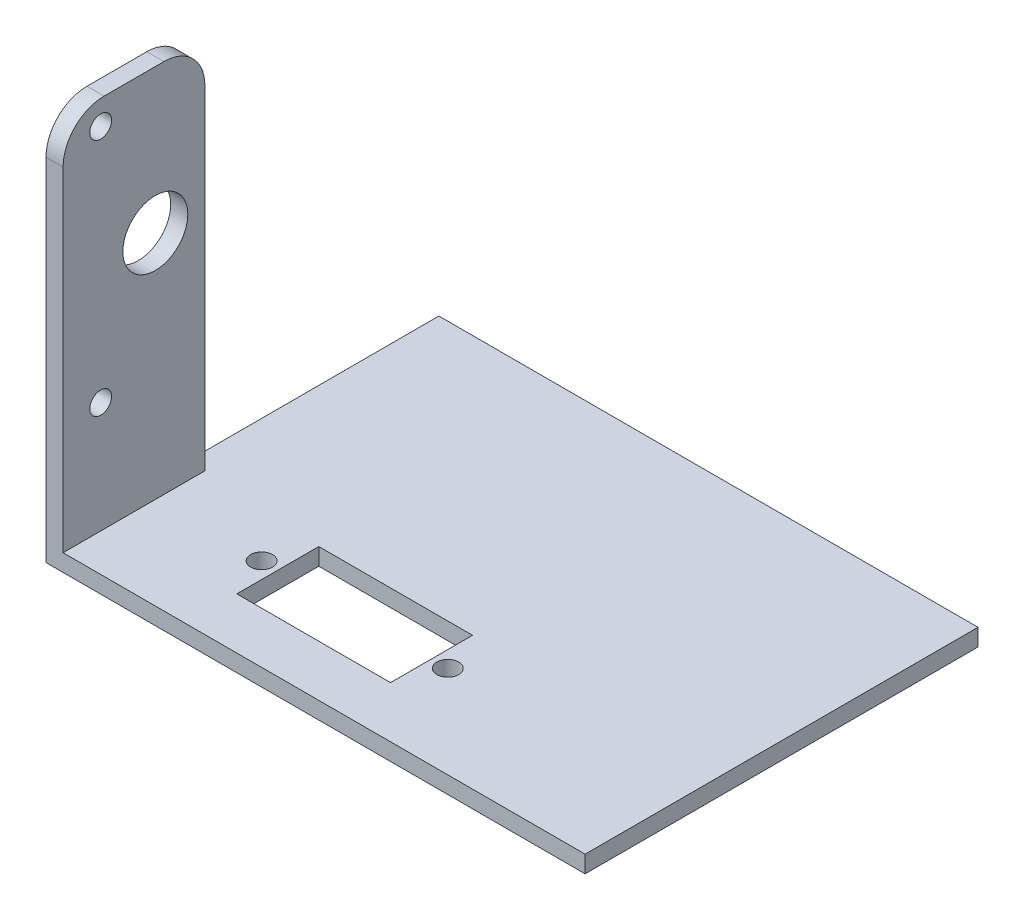
ISO-10303-21;
HEADER;
FILE_DESCRIPTION(('STEP AP214'),'2;1');
FILE_NAME('part.step','',(''),(''),'','','');
FILE_SCHEMA(('AUTOMOTIVE_DESIGN { 1 0 10303 214 1 1 1 1 }'));
ENDSEC;
DATA;
#1=APPLICATION_CONTEXT('core data for automotive mechanical design processes');
#2=APPLICATION_PROTOCOL_DEFINITION('international standard','automotive_design',2000,#1);
#3=PRODUCT_CONTEXT('',#1,'mechanical');
#4=PRODUCT('Part','Part','',(#3));
#5=PRODUCT_RELATED_PRODUCT_CATEGORY('part','',(#4));
#6=PRODUCT_DEFINITION_FORMATION('','',#4);
#7=PRODUCT_DEFINITION_CONTEXT('part definition',#1,'design');
#8=PRODUCT_DEFINITION('design','',#6,#7);
#9=PRODUCT_DEFINITION_SHAPE('','',#8);
#10=(LENGTH_UNIT() NAMED_UNIT(*) SI_UNIT(.MILLI.,.METRE.));
#11=(NAMED_UNIT(*) PLANE_ANGLE_UNIT() SI_UNIT($,.RADIAN.));
#12=(NAMED_UNIT(*) SI_UNIT($,.STERADIAN.) SOLID_ANGLE_UNIT());
#13=UNCERTAINTY_MEASURE_WITH_UNIT(LENGTH_MEASURE(1.E-05),#10,'distance_accuracy_value','');
#14=(GEOMETRIC_REPRESENTATION_CONTEXT(3) GLOBAL_UNCERTAINTY_ASSIGNED_CONTEXT((#13)) GLOBAL_UNIT_ASSIGNED_CONTEXT((#10,
#11,#12)) REPRESENTATION_CONTEXT('',''));
#15=CARTESIAN_POINT('',(0.,0.,0.));
#16=DIRECTION('',(0.,0.,1.));
#17=DIRECTION('',(1.,0.,0.));
#18=AXIS2_PLACEMENT_3D('',#15,#16,#17);
#19=CARTESIAN_POINT('',(0.,2.5,0.));
#20=DIRECTION('',(0.,-1.,0.));
#21=DIRECTION('',(0.,0.,-1.));
#22=AXIS2_PLACEMENT_3D('',#19,#20,#21);
#23=PLANE('',#22);
#24=DIRECTION('',(-1.,0.,0.));
#25=VECTOR('',#24,1.);
#26=CARTESIAN_POINT('',(40.,2.5,30.));
#27=LINE('',#26,#25);
#28=CARTESIAN_POINT('',(16.25,2.5,30.));
#29=VERTEX_POINT('',#28);
#30=CARTESIAN_POINT('',(-6.24999999999999,2.5,30.));
#31=VERTEX_POINT('',#30);
#32=EDGE_CURVE('E151',#29,#31,#27,.T.);
#33=ORIENTED_EDGE('',*,*,#32,.T.);
#34=DIRECTION('',(0.,0.,-1.));
#35=VECTOR('',#34,1.);
#36=CARTESIAN_POINT('',(-6.24999999999999,2.5,0.));
#37=LINE('',#36,#35);
#38=CARTESIAN_POINT('',(-6.24999999999999,2.5,18.));
#39=VERTEX_POINT('',#38);
#40=EDGE_CURVE('E175',#31,#39,#37,.T.);
#41=ORIENTED_EDGE('',*,*,#40,.T.);
#42=DIRECTION('',(-1.,0.,0.));
#43=VECTOR('',#42,1.);
#44=CARTESIAN_POINT('',(0.,2.5,18.));
#45=LINE('',#44,#43);
#46=CARTESIAN_POINT('',(16.25,2.5,18.));
#47=VERTEX_POINT('',#46);
#48=EDGE_CURVE('E172',#47,#39,#45,.T.);
#49=ORIENTED_EDGE('',*,*,#48,.F.);
#50=DIRECTION('',(0.,0.,-1.));
#51=VECTOR('',#50,1.);
#52=CARTESIAN_POINT('',(16.25,2.5,0.));
#53=LINE('',#52,#51);
#54=EDGE_CURVE('E167',#29,#47,#53,.T.);
#55=ORIENTED_EDGE('',*,*,#54,.F.);
#56=EDGE_LOOP('',(#33,#41,#49,#55));
#57=FACE_BOUND('',#56,.T.);
#58=CARTESIAN_POINT('',(-8.625,2.5,24.));
#59=DIRECTION('',(0.,1.,0.));
#60=DIRECTION('',(0.,0.,1.));
#61=AXIS2_PLACEMENT_3D('',#58,#59,#60);
#62=CIRCLE('',#61,1.6);
#63=CARTESIAN_POINT('',(-8.625,2.5,25.6));
#64=VERTEX_POINT('',#63);
#65=EDGE_CURVE('E164',#64,#64,#62,.T.);
#66=ORIENTED_EDGE('',*,*,#65,.F.);
#67=EDGE_LOOP('',(#66));
#68=FACE_BOUND('',#67,.T.);
#69=CARTESIAN_POINT('',(18.625,2.5,24.));
#70=DIRECTION('',(0.,1.,0.));
#71=DIRECTION('',(0.,0.,1.));
#72=AXIS2_PLACEMENT_3D('',#69,#70,#71);
#73=CIRCLE('',#72,1.6);
#74=CARTESIAN_POINT('',(18.625,2.5,25.6));
#75=VERTEX_POINT('',#74);
#76=EDGE_CURVE('E163',#75,#75,#73,.T.);
#77=ORIENTED_EDGE('',*,*,#76,.F.);
#78=EDGE_LOOP('',(#77));
#79=FACE_BOUND('',#78,.T.);
#80=DIRECTION('',(-1.,0.,0.));
#81=VECTOR('',#80,1.);
#82=CARTESIAN_POINT('',(-40.,2.5,37.5));
#83=LINE('',#82,#81);
#84=CARTESIAN_POINT('',(52.225,2.5,37.5));
#85=VERTEX_POINT('',#84);
#86=CARTESIAN_POINT('',(-24.175,2.5,37.5));
#87=VERTEX_POINT('',#86);
#88=EDGE_CURVE('E139',#85,#87,#83,.T.);
#89=ORIENTED_EDGE('',*,*,#88,.F.);
#90=DIRECTION('',(0.,0.,1.));
#91=VECTOR('',#90,1.);
#92=CARTESIAN_POINT('',(52.225,2.5,-20.));
#93=LINE('',#92,#91);
#94=CARTESIAN_POINT('',(52.225,2.5,-20.));
#95=VERTEX_POINT('',#94);
#96=EDGE_CURVE('E127',#95,#85,#93,.T.);
#97=ORIENTED_EDGE('',*,*,#96,.F.);
#98=DIRECTION('',(1.,0.,0.));
#99=VECTOR('',#98,1.);
#100=CARTESIAN_POINT('',(-40.,2.5,-20.));
#101=LINE('',#100,#99);
#102=CARTESIAN_POINT('',(-26.675,2.5,-20.));
#103=VERTEX_POINT('',#102);
#104=EDGE_CURVE('E154',#103,#95,#101,.T.);
#105=ORIENTED_EDGE('',*,*,#104,.F.);
#106=DIRECTION('',(0.,0.,-1.));
#107=VECTOR('',#106,1.);
#108=CARTESIAN_POINT('',(-26.675,2.5,-20.));
#109=LINE('',#108,#107);
#110=CARTESIAN_POINT('',(-26.675,2.5,16.75));
#111=VERTEX_POINT('',#110);
#112=EDGE_CURVE('E143',#111,#103,#109,.T.);
#113=ORIENTED_EDGE('',*,*,#112,.F.);
#114=DIRECTION('',(-1.,0.,0.));
#115=VECTOR('',#114,1.);
#116=CARTESIAN_POINT('',(-24.175,2.5,16.75));
#117=LINE('',#116,#115);
#118=CARTESIAN_POINT('',(-24.175,2.5,16.75));
#119=VERTEX_POINT('',#118);
#120=EDGE_CURVE('E232',#119,#111,#117,.T.);
#121=ORIENTED_EDGE('',*,*,#120,.F.);
#122=DIRECTION('',(0.,0.,-1.));
#123=VECTOR('',#122,1.);
#124=CARTESIAN_POINT('',(-24.175,2.5,37.5));
#125=LINE('',#124,#123);
#126=EDGE_CURVE('E148',#87,#119,#125,.T.);
#127=ORIENTED_EDGE('',*,*,#126,.F.);
#128=EDGE_LOOP('',(#89,#97,#105,#113,#121,#127));
#129=FACE_BOUND('',#128,.T.);
#130=ADVANCED_FACE('F35',(#57,#68,#79,#129),#23,.F.);
#131=CARTESIAN_POINT('',(0.,0.,0.));
#132=DIRECTION('',(0.,-1.,0.));
#133=DIRECTION('',(0.,0.,-1.));
#134=AXIS2_PLACEMENT_3D('',#131,#132,#133);
#135=PLANE('',#134);
#136=DIRECTION('',(0.,0.,1.));
#137=VECTOR('',#136,1.);
#138=CARTESIAN_POINT('',(52.225,0.,-20.));
#139=LINE('',#138,#137);
#140=CARTESIAN_POINT('',(52.225,0.,-20.));
#141=VERTEX_POINT('',#140);
#142=CARTESIAN_POINT('',(52.225,0.,37.5));
#143=VERTEX_POINT('',#142);
#144=EDGE_CURVE('E50',#141,#143,#139,.T.);
#145=ORIENTED_EDGE('',*,*,#144,.T.);
#146=DIRECTION('',(1.,0.,0.));
#147=VECTOR('',#146,1.);
#148=CARTESIAN_POINT('',(-40.,0.,37.5));
#149=LINE('',#148,#147);
#150=CARTESIAN_POINT('',(-26.675,0.,37.5));
#151=VERTEX_POINT('',#150);
#152=EDGE_CURVE('E142',#151,#143,#149,.T.);
#153=ORIENTED_EDGE('',*,*,#152,.F.);
#154=DIRECTION('',(0.,0.,-1.));
#155=VECTOR('',#154,1.);
#156=CARTESIAN_POINT('',(-26.675,0.,-20.));
#157=LINE('',#156,#155);
#158=CARTESIAN_POINT('',(-26.675,0.,-20.));
#159=VERTEX_POINT('',#158);
#160=EDGE_CURVE('E249',#151,#159,#157,.T.);
#161=ORIENTED_EDGE('',*,*,#160,.T.);
#162=DIRECTION('',(1.,0.,0.));
#163=VECTOR('',#162,1.);
#164=CARTESIAN_POINT('',(-40.,0.,-20.));
#165=LINE('',#164,#163);
#166=EDGE_CURVE('E149',#159,#141,#165,.T.);
#167=ORIENTED_EDGE('',*,*,#166,.T.);
#168=EDGE_LOOP('',(#145,#153,#161,#167));
#169=FACE_BOUND('',#168,.T.);
#170=CARTESIAN_POINT('',(18.625,0.,24.));
#171=DIRECTION('',(0.,-1.,0.));
#172=DIRECTION('',(0.,0.,-1.));
#173=AXIS2_PLACEMENT_3D('',#170,#171,#172);
#174=CIRCLE('',#173,1.6);
#175=CARTESIAN_POINT('',(18.625,0.,25.6));
#176=VERTEX_POINT('',#175);
#177=EDGE_CURVE('E193',#176,#176,#174,.T.);
#178=ORIENTED_EDGE('',*,*,#177,.F.);
#179=EDGE_LOOP('',(#178));
#180=FACE_BOUND('',#179,.T.);
#181=CARTESIAN_POINT('',(-8.625,0.,24.));
#182=DIRECTION('',(0.,-1.,0.));
#183=DIRECTION('',(0.,0.,-1.));
#184=AXIS2_PLACEMENT_3D('',#181,#182,#183);
#185=CIRCLE('',#184,1.6);
#186=CARTESIAN_POINT('',(-8.625,0.,25.6));
#187=VERTEX_POINT('',#186);
#188=EDGE_CURVE('E182',#187,#187,#185,.T.);
#189=ORIENTED_EDGE('',*,*,#188,.F.);
#190=EDGE_LOOP('',(#189));
#191=FACE_BOUND('',#190,.T.);
#192=DIRECTION('',(1.,0.,0.));
#193=VECTOR('',#192,1.);
#194=CARTESIAN_POINT('',(0.,0.,18.));
#195=LINE('',#194,#193);
#196=CARTESIAN_POINT('',(-6.24999999999999,0.,18.));
#197=VERTEX_POINT('',#196);
#198=CARTESIAN_POINT('',(16.25,0.,18.));
#199=VERTEX_POINT('',#198);
#200=EDGE_CURVE('E192',#197,#199,#195,.T.);
#201=ORIENTED_EDGE('',*,*,#200,.F.);
#202=DIRECTION('',(0.,0.,1.));
#203=VECTOR('',#202,1.);
#204=CARTESIAN_POINT('',(-6.24999999999999,0.,0.));
#205=LINE('',#204,#203);
#206=CARTESIAN_POINT('',(-6.24999999999999,0.,30.));
#207=VERTEX_POINT('',#206);
#208=EDGE_CURVE('E196',#197,#207,#205,.T.);
#209=ORIENTED_EDGE('',*,*,#208,.T.);
#210=DIRECTION('',(-1.,0.,0.));
#211=VECTOR('',#210,1.);
#212=CARTESIAN_POINT('',(40.,0.,30.));
#213=LINE('',#212,#211);
#214=CARTESIAN_POINT('',(16.25,0.,30.));
#215=VERTEX_POINT('',#214);
#216=EDGE_CURVE('E160',#215,#207,#213,.T.);
#217=ORIENTED_EDGE('',*,*,#216,.F.);
#218=DIRECTION('',(0.,0.,1.));
#219=VECTOR('',#218,1.);
#220=CARTESIAN_POINT('',(16.25,0.,0.));
#221=LINE('',#220,#219);
#222=EDGE_CURVE('E189',#199,#215,#221,.T.);
#223=ORIENTED_EDGE('',*,*,#222,.F.);
#224=EDGE_LOOP('',(#201,#209,#217,#223));
#225=FACE_BOUND('',#224,.T.);
#226=ADVANCED_FACE('F284',(#169,#180,#191,#225),#135,.T.);
#227=CARTESIAN_POINT('',(-6.24999999999999,-1.2E-05,0.));
#228=DIRECTION('',(1.,0.,0.));
#229=DIRECTION('',(0.,0.,-1.));
#230=AXIS2_PLACEMENT_3D('',#227,#228,#229);
#231=PLANE('',#230);
#232=DIRECTION('',(0.,1.,0.));
#233=VECTOR('',#232,1.);
#234=CARTESIAN_POINT('',(-6.24999999999999,-1.2E-05,18.));
#235=LINE('',#234,#233);
#236=EDGE_CURVE('E183',#197,#39,#235,.T.);
#237=ORIENTED_EDGE('',*,*,#236,.T.);
#238=ORIENTED_EDGE('',*,*,#40,.F.);
#239=DIRECTION('',(0.,1.,0.));
#240=VECTOR('',#239,1.);
#241=CARTESIAN_POINT('',(-6.24999999999999,-1.2E-05,30.));
#242=LINE('',#241,#240);
#243=EDGE_CURVE('E179',#207,#31,#242,.T.);
#244=ORIENTED_EDGE('',*,*,#243,.F.);
#245=ORIENTED_EDGE('',*,*,#208,.F.);
#246=EDGE_LOOP('',(#237,#238,#244,#245));
#247=FACE_BOUND('',#246,.T.);
#248=ADVANCED_FACE('F301',(#247),#231,.T.);
#249=CARTESIAN_POINT('',(0.,-1.2E-05,18.));
#250=DIRECTION('',(0.,0.,-1.));
#251=DIRECTION('',(-1.,0.,0.));
#252=AXIS2_PLACEMENT_3D('',#249,#250,#251);
#253=PLANE('',#252);
#254=ORIENTED_EDGE('',*,*,#200,.T.);
#255=DIRECTION('',(0.,1.,0.));
#256=VECTOR('',#255,1.);
#257=CARTESIAN_POINT('',(16.25,-1.2E-05,18.));
#258=LINE('',#257,#256);
#259=EDGE_CURVE('E185',#199,#47,#258,.T.);
#260=ORIENTED_EDGE('',*,*,#259,.T.);
#261=ORIENTED_EDGE('',*,*,#48,.T.);
#262=ORIENTED_EDGE('',*,*,#236,.F.);
#263=EDGE_LOOP('',(#254,#260,#261,#262));
#264=FACE_BOUND('',#263,.T.);
#265=ADVANCED_FACE('F309',(#264),#253,.F.);
#266=CARTESIAN_POINT('',(16.25,-1.2E-05,0.));
#267=DIRECTION('',(1.,0.,0.));
#268=DIRECTION('',(0.,0.,-1.));
#269=AXIS2_PLACEMENT_3D('',#266,#267,#268);
#270=PLANE('',#269);
#271=ORIENTED_EDGE('',*,*,#222,.T.);
#272=DIRECTION('',(0.,1.,0.));
#273=VECTOR('',#272,1.);
#274=CARTESIAN_POINT('',(16.25,-1.2E-05,30.));
#275=LINE('',#274,#273);
#276=EDGE_CURVE('E178',#215,#29,#275,.T.);
#277=ORIENTED_EDGE('',*,*,#276,.T.);
#278=ORIENTED_EDGE('',*,*,#54,.T.);
#279=ORIENTED_EDGE('',*,*,#259,.F.);
#280=EDGE_LOOP('',(#271,#277,#278,#279));
#281=FACE_BOUND('',#280,.T.);
#282=ADVANCED_FACE('F305',(#281),#270,.F.);
#283=CARTESIAN_POINT('',(-8.625,-1.2E-05,24.));
#284=DIRECTION('',(0.,1.,0.));
#285=DIRECTION('',(0.,0.,1.));
#286=AXIS2_PLACEMENT_3D('',#283,#284,#285);
#287=CYLINDRICAL_SURFACE('',#286,1.6);
#288=CARTESIAN_POINT('',(-8.625,0.,25.6));
#289=CARTESIAN_POINT('',(-8.625,0.0260416666666666,25.6));
#290=CARTESIAN_POINT('',(-8.625,0.0520833333333333,25.6));
#291=CARTESIAN_POINT('',(-8.625,0.104166666666667,25.6));
#292=CARTESIAN_POINT('',(-8.625,0.130208333333333,25.6));
#293=CARTESIAN_POINT('',(-8.625,0.182291666666667,25.6));
#294=CARTESIAN_POINT('',(-8.625,0.208333333333333,25.6));
#295=CARTESIAN_POINT('',(-8.625,0.260416666666667,25.6));
#296=CARTESIAN_POINT('',(-8.625,0.286458333333333,25.6));
#297=CARTESIAN_POINT('',(-8.625,0.338541666666667,25.6));
#298=CARTESIAN_POINT('',(-8.625,0.364583333333333,25.6));
#299=CARTESIAN_POINT('',(-8.625,0.416666666666667,25.6));
#300=CARTESIAN_POINT('',(-8.625,0.442708333333333,25.6));
#301=CARTESIAN_POINT('',(-8.625,0.494791666666667,25.6));
#302=CARTESIAN_POINT('',(-8.625,0.520833333333333,25.6));
#303=CARTESIAN_POINT('',(-8.625,0.572916666666667,25.6));
#304=CARTESIAN_POINT('',(-8.625,0.598958333333333,25.6));
#305=CARTESIAN_POINT('',(-8.625,0.651041666666667,25.6));
#306=CARTESIAN_POINT('',(-8.625,0.677083333333333,25.6));
#307=CARTESIAN_POINT('',(-8.625,0.729166666666667,25.6));
#308=CARTESIAN_POINT('',(-8.625,0.755208333333333,25.6));
#309=CARTESIAN_POINT('',(-8.625,0.807291666666667,25.6));
#310=CARTESIAN_POINT('',(-8.625,0.833333333333333,25.6));
#311=CARTESIAN_POINT('',(-8.625,0.885416666666667,25.6));
#312=CARTESIAN_POINT('',(-8.625,0.911458333333333,25.6));
#313=CARTESIAN_POINT('',(-8.625,0.963541666666667,25.6));
#314=CARTESIAN_POINT('',(-8.625,0.989583333333333,25.6));
#315=CARTESIAN_POINT('',(-8.625,1.04166666666667,25.6));
#316=CARTESIAN_POINT('',(-8.625,1.06770833333333,25.6));
#317=CARTESIAN_POINT('',(-8.625,1.11979166666667,25.6));
#318=CARTESIAN_POINT('',(-8.625,1.14583333333333,25.6));
#319=CARTESIAN_POINT('',(-8.625,1.19791666666667,25.6));
#320=CARTESIAN_POINT('',(-8.625,1.22395833333333,25.6));
#321=CARTESIAN_POINT('',(-8.625,1.27604166666667,25.6));
#322=CARTESIAN_POINT('',(-8.625,1.30208333333333,25.6));
#323=CARTESIAN_POINT('',(-8.625,1.35416666666667,25.6));
#324=CARTESIAN_POINT('',(-8.625,1.38020833333333,25.6));
#325=CARTESIAN_POINT('',(-8.625,1.43229166666667,25.6));
#326=CARTESIAN_POINT('',(-8.625,1.45833333333333,25.6));
#327=CARTESIAN_POINT('',(-8.625,1.51041666666667,25.6));
#328=CARTESIAN_POINT('',(-8.625,1.53645833333333,25.6));
#329=CARTESIAN_POINT('',(-8.625,1.58854166666667,25.6));
#330=CARTESIAN_POINT('',(-8.625,1.61458333333333,25.6));
#331=CARTESIAN_POINT('',(-8.625,1.66666666666667,25.6));
#332=CARTESIAN_POINT('',(-8.625,1.69270833333333,25.6));
#333=CARTESIAN_POINT('',(-8.625,1.74479166666667,25.6));
#334=CARTESIAN_POINT('',(-8.625,1.77083333333333,25.6));
#335=CARTESIAN_POINT('',(-8.625,1.82291666666667,25.6));
#336=CARTESIAN_POINT('',(-8.625,1.84895833333333,25.6));
#337=CARTESIAN_POINT('',(-8.625,1.90104166666667,25.6));
#338=CARTESIAN_POINT('',(-8.625,1.92708333333333,25.6));
#339=CARTESIAN_POINT('',(-8.625,1.97916666666667,25.6));
#340=CARTESIAN_POINT('',(-8.625,2.00520833333333,25.6));
#341=CARTESIAN_POINT('',(-8.625,2.05729166666667,25.6));
#342=CARTESIAN_POINT('',(-8.625,2.08333333333333,25.6));
#343=CARTESIAN_POINT('',(-8.625,2.13541666666667,25.6));
#344=CARTESIAN_POINT('',(-8.625,2.16145833333333,25.6));
#345=CARTESIAN_POINT('',(-8.625,2.21354166666667,25.6));
#346=CARTESIAN_POINT('',(-8.625,2.23958333333333,25.6));
#347=CARTESIAN_POINT('',(-8.625,2.29166666666667,25.6));
#348=CARTESIAN_POINT('',(-8.625,2.31770833333333,25.6));
#349=CARTESIAN_POINT('',(-8.625,2.36979166666667,25.6));
#350=CARTESIAN_POINT('',(-8.625,2.39583333333333,25.6));
#351=CARTESIAN_POINT('',(-8.625,2.44791666666667,25.6));
#352=CARTESIAN_POINT('',(-8.625,2.47395833333333,25.6));
#353=CARTESIAN_POINT('',(-8.625,2.5,25.6));
#354=B_SPLINE_CURVE_WITH_KNOTS('',3,(#288,#289,#290,#291,#292,#293,#294,#295,#296,#297,#298,
#299,#300,#301,#302,#303,#304,#305,#306,#307,#308,#309,#310,#311,#312,#313,#314,#315,#316,#317,
#318,#319,#320,#321,#322,#323,#324,#325,#326,#327,#328,#329,#330,#331,#332,#333,#334,#335,#336,
#337,#338,#339,#340,#341,#342,#343,#344,#345,#346,#347,#348,#349,#350,#351,#352,#353),
.UNSPECIFIED.,.F.,.F.,(4,2,2,2,2,2,2,2,2,2,2,2,2,2,2,2,2,2,2,2,2,2,2,2,2,2,2,2,2,2,2,2,4),(0.,
0.078125,0.15625,0.234375,0.3125,0.390625,0.46875,0.546875,0.625,0.703125,0.78125,0.859375,
0.9375,1.015625,1.09375,1.171875,1.25,1.328125,1.40625,1.484375,1.5625,1.640625,1.71875,
1.796875,1.875,1.953125,2.03125,2.109375,2.1875,2.265625,2.34375,2.421875,2.5),.UNSPECIFIED.);
#355=EDGE_CURVE('BSEAM308',#187,#64,#354,.T.);
#356=ORIENTED_EDGE('',*,*,#188,.T.);
#357=ORIENTED_EDGE('',*,*,#65,.T.);
#358=ORIENTED_EDGE('',*,*,#355,.T.);
#359=ORIENTED_EDGE('',*,*,#355,.F.);
#360=EDGE_LOOP('',(#356,#358,#357,#359));
#361=FACE_BOUND('',#360,.T.);
#362=ADVANCED_FACE('F308',(#361),#287,.F.);
#363=CARTESIAN_POINT('',(18.625,-1.2E-05,24.));
#364=DIRECTION('',(0.,1.,0.));
#365=DIRECTION('',(0.,0.,1.));
#366=AXIS2_PLACEMENT_3D('',#363,#364,#365);
#367=CYLINDRICAL_SURFACE('',#366,1.6);
#368=CARTESIAN_POINT('',(18.625,0.,25.6));
#369=CARTESIAN_POINT('',(18.625,0.0260416666666666,25.6));
#370=CARTESIAN_POINT('',(18.625,0.0520833333333333,25.6));
#371=CARTESIAN_POINT('',(18.625,0.104166666666667,25.6));
#372=CARTESIAN_POINT('',(18.625,0.130208333333333,25.6));
#373=CARTESIAN_POINT('',(18.625,0.182291666666667,25.6));
#374=CARTESIAN_POINT('',(18.625,0.208333333333333,25.6));
#375=CARTESIAN_POINT('',(18.625,0.260416666666667,25.6));
#376=CARTESIAN_POINT('',(18.625,0.286458333333333,25.6));
#377=CARTESIAN_POINT('',(18.625,0.338541666666667,25.6));
#378=CARTESIAN_POINT('',(18.625,0.364583333333333,25.6));
#379=CARTESIAN_POINT('',(18.625,0.416666666666667,25.6));
#380=CARTESIAN_POINT('',(18.625,0.442708333333333,25.6));
#381=CARTESIAN_POINT('',(18.625,0.494791666666667,25.6));
#382=CARTESIAN_POINT('',(18.625,0.520833333333333,25.6));
#383=CARTESIAN_POINT('',(18.625,0.572916666666667,25.6));
#384=CARTESIAN_POINT('',(18.625,0.598958333333333,25.6));
#385=CARTESIAN_POINT('',(18.625,0.651041666666667,25.6));
#386=CARTESIAN_POINT('',(18.625,0.677083333333333,25.6));
#387=CARTESIAN_POINT('',(18.625,0.729166666666667,25.6));
#388=CARTESIAN_POINT('',(18.625,0.755208333333333,25.6));
#389=CARTESIAN_POINT('',(18.625,0.807291666666667,25.6));
#390=CARTESIAN_POINT('',(18.625,0.833333333333333,25.6));
#391=CARTESIAN_POINT('',(18.625,0.885416666666667,25.6));
#392=CARTESIAN_POINT('',(18.625,0.911458333333333,25.6));
#393=CARTESIAN_POINT('',(18.625,0.963541666666667,25.6));
#394=CARTESIAN_POINT('',(18.625,0.989583333333333,25.6));
#395=CARTESIAN_POINT('',(18.625,1.04166666666667,25.6));
#396=CARTESIAN_POINT('',(18.625,1.06770833333333,25.6));
#397=CARTESIAN_POINT('',(18.625,1.11979166666667,25.6));
#398=CARTESIAN_POINT('',(18.625,1.14583333333333,25.6));
#399=CARTESIAN_POINT('',(18.625,1.19791666666667,25.6));
#400=CARTESIAN_POINT('',(18.625,1.22395833333333,25.6));
#401=CARTESIAN_POINT('',(18.625,1.27604166666667,25.6));
#402=CARTESIAN_POINT('',(18.625,1.30208333333333,25.6));
#403=CARTESIAN_POINT('',(18.625,1.35416666666667,25.6));
#404=CARTESIAN_POINT('',(18.625,1.38020833333333,25.6));
#405=CARTESIAN_POINT('',(18.625,1.43229166666667,25.6));
#406=CARTESIAN_POINT('',(18.625,1.45833333333333,25.6));
#407=CARTESIAN_POINT('',(18.625,1.51041666666667,25.6));
#408=CARTESIAN_POINT('',(18.625,1.53645833333333,25.6));
#409=CARTESIAN_POINT('',(18.625,1.58854166666667,25.6));
#410=CARTESIAN_POINT('',(18.625,1.61458333333333,25.6));
#411=CARTESIAN_POINT('',(18.625,1.66666666666667,25.6));
#412=CARTESIAN_POINT('',(18.625,1.69270833333333,25.6));
#413=CARTESIAN_POINT('',(18.625,1.74479166666667,25.6));
#414=CARTESIAN_POINT('',(18.625,1.77083333333333,25.6));
#415=CARTESIAN_POINT('',(18.625,1.82291666666667,25.6));
#416=CARTESIAN_POINT('',(18.625,1.84895833333333,25.6));
#417=CARTESIAN_POINT('',(18.625,1.90104166666667,25.6));
#418=CARTESIAN_POINT('',(18.625,1.92708333333333,25.6));
#419=CARTESIAN_POINT('',(18.625,1.97916666666667,25.6));
#420=CARTESIAN_POINT('',(18.625,2.00520833333333,25.6));
#421=CARTESIAN_POINT('',(18.625,2.05729166666667,25.6));
#422=CARTESIAN_POINT('',(18.625,2.08333333333333,25.6));
#423=CARTESIAN_POINT('',(18.625,2.13541666666667,25.6));
#424=CARTESIAN_POINT('',(18.625,2.16145833333333,25.6));
#425=CARTESIAN_POINT('',(18.625,2.21354166666667,25.6));
#426=CARTESIAN_POINT('',(18.625,2.23958333333333,25.6));
#427=CARTESIAN_POINT('',(18.625,2.29166666666667,25.6));
#428=CARTESIAN_POINT('',(18.625,2.31770833333333,25.6));
#429=CARTESIAN_POINT('',(18.625,2.36979166666667,25.6));
#430=CARTESIAN_POINT('',(18.625,2.39583333333333,25.6));
#431=CARTESIAN_POINT('',(18.625,2.44791666666667,25.6));
#432=CARTESIAN_POINT('',(18.625,2.47395833333333,25.6));
#433=CARTESIAN_POINT('',(18.625,2.5,25.6));
#434=B_SPLINE_CURVE_WITH_KNOTS('',3,(#368,#369,#370,#371,#372,#373,#374,#375,#376,#377,#378,
#379,#380,#381,#382,#383,#384,#385,#386,#387,#388,#389,#390,#391,#392,#393,#394,#395,#396,#397,
#398,#399,#400,#401,#402,#403,#404,#405,#406,#407,#408,#409,#410,#411,#412,#413,#414,#415,#416,
#417,#418,#419,#420,#421,#422,#423,#424,#425,#426,#427,#428,#429,#430,#431,#432,#433),
.UNSPECIFIED.,.F.,.F.,(4,2,2,2,2,2,2,2,2,2,2,2,2,2,2,2,2,2,2,2,2,2,2,2,2,2,2,2,2,2,2,2,4),(0.,
0.078125,0.15625,0.234375,0.3125,0.390625,0.46875,0.546875,0.625,0.703125,0.78125,0.859375,
0.9375,1.015625,1.09375,1.171875,1.25,1.328125,1.40625,1.484375,1.5625,1.640625,1.71875,
1.796875,1.875,1.953125,2.03125,2.109375,2.1875,2.265625,2.34375,2.421875,2.5),.UNSPECIFIED.);
#435=EDGE_CURVE('BSEAM317',#176,#75,#434,.T.);
#436=ORIENTED_EDGE('',*,*,#177,.T.);
#437=ORIENTED_EDGE('',*,*,#76,.T.);
#438=ORIENTED_EDGE('',*,*,#435,.T.);
#439=ORIENTED_EDGE('',*,*,#435,.F.);
#440=EDGE_LOOP('',(#436,#438,#437,#439));
#441=FACE_BOUND('',#440,.T.);
#442=ADVANCED_FACE('F317',(#441),#367,.F.);
#443=CARTESIAN_POINT('',(40.,-80.1888396224811,30.));
#444=DIRECTION('',(0.,0.,-1.));
#445=DIRECTION('',(-1.,0.,0.));
#446=AXIS2_PLACEMENT_3D('',#443,#444,#445);
#447=PLANE('',#446);
#448=ORIENTED_EDGE('',*,*,#216,.T.);
#449=ORIENTED_EDGE('',*,*,#243,.T.);
#450=ORIENTED_EDGE('',*,*,#32,.F.);
#451=ORIENTED_EDGE('',*,*,#276,.F.);
#452=EDGE_LOOP('',(#448,#449,#450,#451));
#453=FACE_BOUND('',#452,.T.);
#454=ADVANCED_FACE('F320',(#453),#447,.T.);
#455=CARTESIAN_POINT('',(0.,0.,37.5));
#456=DIRECTION('',(0.,0.,1.));
#457=DIRECTION('',(1.,0.,0.));
#458=AXIS2_PLACEMENT_3D('',#455,#456,#457);
#459=PLANE('',#458);
#460=DIRECTION('',(0.,1.,0.));
#461=VECTOR('',#460,1.);
#462=CARTESIAN_POINT('',(52.225,-57.5782076831157,37.5));
#463=LINE('',#462,#461);
#464=EDGE_CURVE('E130',#143,#85,#463,.T.);
#465=ORIENTED_EDGE('',*,*,#464,.T.);
#466=ORIENTED_EDGE('',*,*,#88,.T.);
#467=DIRECTION('',(0.,-1.,0.));
#468=VECTOR('',#467,1.);
#469=CARTESIAN_POINT('',(-24.175,97.9000598085269,37.5));
#470=LINE('',#469,#468);
#471=CARTESIAN_POINT('',(-24.175,51.375,37.5));
#472=VERTEX_POINT('',#471);
#473=EDGE_CURVE('E272',#472,#87,#470,.T.);
#474=ORIENTED_EDGE('',*,*,#473,.F.);
#475=DIRECTION('',(1.,0.,0.));
#476=VECTOR('',#475,1.);
#477=CARTESIAN_POINT('',(-26.675,51.375,37.5));
#478=LINE('',#477,#476);
#479=CARTESIAN_POINT('',(-26.675,51.375,37.5));
#480=VERTEX_POINT('',#479);
#481=EDGE_CURVE('E11',#472,#480,#478,.F.);
#482=ORIENTED_EDGE('',*,*,#481,.T.);
#483=DIRECTION('',(0.,-1.,0.));
#484=VECTOR('',#483,1.);
#485=CARTESIAN_POINT('',(-26.675,97.9000598085269,37.5));
#486=LINE('',#485,#484);
#487=EDGE_CURVE('E259',#480,#151,#486,.T.);
#488=ORIENTED_EDGE('',*,*,#487,.T.);
#489=ORIENTED_EDGE('',*,*,#152,.T.);
#490=EDGE_LOOP('',(#465,#466,#474,#482,#488,#489));
#491=FACE_BOUND('',#490,.T.);
#492=ADVANCED_FACE('F138',(#491),#459,.T.);
#493=CARTESIAN_POINT('',(-40.,0.,-20.));
#494=DIRECTION('',(0.,0.,1.));
#495=DIRECTION('',(1.,0.,0.));
#496=AXIS2_PLACEMENT_3D('',#493,#494,#495);
#497=PLANE('',#496);
#498=ORIENTED_EDGE('',*,*,#104,.T.);
#499=DIRECTION('',(0.,1.,0.));
#500=VECTOR('',#499,1.);
#501=CARTESIAN_POINT('',(52.225,-57.5782076831157,-20.));
#502=LINE('',#501,#500);
#503=EDGE_CURVE('E131',#141,#95,#502,.T.);
#504=ORIENTED_EDGE('',*,*,#503,.F.);
#505=ORIENTED_EDGE('',*,*,#166,.F.);
#506=DIRECTION('',(0.,1.,0.));
#507=VECTOR('',#506,1.);
#508=CARTESIAN_POINT('',(-26.675,-59.0237716941234,-20.));
#509=LINE('',#508,#507);
#510=EDGE_CURVE('E244',#159,#103,#509,.T.);
#511=ORIENTED_EDGE('',*,*,#510,.T.);
#512=EDGE_LOOP('',(#498,#504,#505,#511));
#513=FACE_BOUND('',#512,.T.);
#514=ADVANCED_FACE('F276',(#513),#497,.F.);
#515=CARTESIAN_POINT('',(-24.175,97.9000598085269,37.5));
#516=DIRECTION('',(-1.,0.,0.));
#517=DIRECTION('',(0.,0.,1.));
#518=AXIS2_PLACEMENT_3D('',#515,#516,#517);
#519=PLANE('',#518);
#520=CARTESIAN_POINT('',(-24.175,36.275,24.));
#521=DIRECTION('',(1.,0.,0.));
#522=DIRECTION('',(0.,0.,-1.));
#523=AXIS2_PLACEMENT_3D('',#520,#521,#522);
#524=CIRCLE('',#523,4.75);
#525=CARTESIAN_POINT('',(-24.175,36.275,19.25));
#526=VERTEX_POINT('',#525);
#527=EDGE_CURVE('E252',#526,#526,#524,.T.);
#528=ORIENTED_EDGE('',*,*,#527,.F.);
#529=EDGE_LOOP('',(#528));
#530=FACE_BOUND('',#529,.T.);
#531=CARTESIAN_POINT('',(-24.175,18.775,32.));
#532=DIRECTION('',(1.,0.,0.));
#533=DIRECTION('',(0.,0.,-1.));
#534=AXIS2_PLACEMENT_3D('',#531,#532,#533);
#535=CIRCLE('',#534,1.6);
#536=CARTESIAN_POINT('',(-24.175,18.775,30.4));
#537=VERTEX_POINT('',#536);
#538=EDGE_CURVE('E256',#537,#537,#535,.T.);
#539=ORIENTED_EDGE('',*,*,#538,.F.);
#540=EDGE_LOOP('',(#539));
#541=FACE_BOUND('',#540,.T.);
#542=CARTESIAN_POINT('',(-24.175,53.775,32.));
#543=DIRECTION('',(1.,0.,0.));
#544=DIRECTION('',(0.,0.,-1.));
#545=AXIS2_PLACEMENT_3D('',#542,#543,#544);
#546=CIRCLE('',#545,1.6);
#547=CARTESIAN_POINT('',(-24.175,53.775,30.4));
#548=VERTEX_POINT('',#547);
#549=EDGE_CURVE('E263',#548,#548,#546,.T.);
#550=ORIENTED_EDGE('',*,*,#549,.F.);
#551=EDGE_LOOP('',(#550));
#552=FACE_BOUND('',#551,.T.);
#553=DIRECTION('',(0.,-1.,0.));
#554=VECTOR('',#553,1.);
#555=CARTESIAN_POINT('',(-24.175,97.9000598085269,16.75));
#556=LINE('',#555,#554);
#557=CARTESIAN_POINT('',(-24.175,51.375,16.75));
#558=VERTEX_POINT('',#557);
#559=EDGE_CURVE('E240',#558,#119,#556,.T.);
#560=ORIENTED_EDGE('',*,*,#559,.F.);
#561=CARTESIAN_POINT('',(-24.175,51.375,22.75));
#562=DIRECTION('',(-1.,0.,0.));
#563=DIRECTION('',(0.,0.,1.));
#564=AXIS2_PLACEMENT_3D('',#561,#562,#563);
#565=CIRCLE('',#564,6.);
#566=CARTESIAN_POINT('',(-24.175,57.375,22.75));
#567=VERTEX_POINT('',#566);
#568=EDGE_CURVE('E208',#558,#567,#565,.F.);
#569=ORIENTED_EDGE('',*,*,#568,.T.);
#570=DIRECTION('',(0.,0.,-1.));
#571=VECTOR('',#570,1.);
#572=CARTESIAN_POINT('',(-24.175,57.375,37.5));
#573=LINE('',#572,#571);
#574=CARTESIAN_POINT('',(-24.175,57.375,31.5));
#575=VERTEX_POINT('',#574);
#576=EDGE_CURVE('E239',#575,#567,#573,.T.);
#577=ORIENTED_EDGE('',*,*,#576,.F.);
#578=CARTESIAN_POINT('',(-24.175,51.375,31.5));
#579=DIRECTION('',(-1.,0.,0.));
#580=DIRECTION('',(0.,0.,1.));
#581=AXIS2_PLACEMENT_3D('',#578,#579,#580);
#582=CIRCLE('',#581,6.);
#583=EDGE_CURVE('E206',#575,#472,#582,.F.);
#584=ORIENTED_EDGE('',*,*,#583,.T.);
#585=ORIENTED_EDGE('',*,*,#473,.T.);
#586=ORIENTED_EDGE('',*,*,#126,.T.);
#587=EDGE_LOOP('',(#560,#569,#577,#584,#585,#586));
#588=FACE_BOUND('',#587,.T.);
#589=ADVANCED_FACE('F238',(#530,#541,#552,#588),#519,.F.);
#590=CARTESIAN_POINT('',(-24.175,97.9000598085269,16.75));
#591=DIRECTION('',(0.,0.,1.));
#592=DIRECTION('',(1.,0.,0.));
#593=AXIS2_PLACEMENT_3D('',#590,#591,#592);
#594=PLANE('',#593);
#595=DIRECTION('',(0.,-1.,0.));
#596=VECTOR('',#595,1.);
#597=CARTESIAN_POINT('',(-26.675,97.9000598085269,16.75));
#598=LINE('',#597,#596);
#599=CARTESIAN_POINT('',(-26.675,51.375,16.75));
#600=VERTEX_POINT('',#599);
#601=EDGE_CURVE('E222',#600,#111,#598,.T.);
#602=ORIENTED_EDGE('',*,*,#601,.F.);
#603=DIRECTION('',(1.,0.,0.));
#604=VECTOR('',#603,1.);
#605=CARTESIAN_POINT('',(-24.175,51.375,16.75));
#606=LINE('',#605,#604);
#607=EDGE_CURVE('E199',#600,#558,#606,.T.);
#608=ORIENTED_EDGE('',*,*,#607,.T.);
#609=ORIENTED_EDGE('',*,*,#559,.T.);
#610=ORIENTED_EDGE('',*,*,#120,.T.);
#611=EDGE_LOOP('',(#602,#608,#609,#610));
#612=FACE_BOUND('',#611,.T.);
#613=ADVANCED_FACE('F230',(#612),#594,.F.);
#614=CARTESIAN_POINT('',(-26.675,97.9000598085269,16.75));
#615=DIRECTION('',(1.,0.,0.));
#616=DIRECTION('',(0.,0.,-1.));
#617=AXIS2_PLACEMENT_3D('',#614,#615,#616);
#618=PLANE('',#617);
#619=CARTESIAN_POINT('',(-26.675,36.275,24.));
#620=DIRECTION('',(1.,0.,0.));
#621=DIRECTION('',(0.,0.,-1.));
#622=AXIS2_PLACEMENT_3D('',#619,#620,#621);
#623=CIRCLE('',#622,4.75);
#624=CARTESIAN_POINT('',(-26.675,36.275,19.25));
#625=VERTEX_POINT('',#624);
#626=EDGE_CURVE('E255',#625,#625,#623,.F.);
#627=ORIENTED_EDGE('',*,*,#626,.F.);
#628=EDGE_LOOP('',(#627));
#629=FACE_BOUND('',#628,.T.);
#630=CARTESIAN_POINT('',(-26.675,18.775,32.));
#631=DIRECTION('',(1.,0.,0.));
#632=DIRECTION('',(0.,0.,-1.));
#633=AXIS2_PLACEMENT_3D('',#630,#631,#632);
#634=CIRCLE('',#633,1.6);
#635=CARTESIAN_POINT('',(-26.675,18.775,30.4));
#636=VERTEX_POINT('',#635);
#637=EDGE_CURVE('E260',#636,#636,#634,.F.);
#638=ORIENTED_EDGE('',*,*,#637,.F.);
#639=EDGE_LOOP('',(#638));
#640=FACE_BOUND('',#639,.T.);
#641=CARTESIAN_POINT('',(-26.675,53.775,32.));
#642=DIRECTION('',(1.,0.,0.));
#643=DIRECTION('',(0.,0.,-1.));
#644=AXIS2_PLACEMENT_3D('',#641,#642,#643);
#645=CIRCLE('',#644,1.6);
#646=CARTESIAN_POINT('',(-26.675,53.775,30.4));
#647=VERTEX_POINT('',#646);
#648=EDGE_CURVE('E246',#647,#647,#645,.F.);
#649=ORIENTED_EDGE('',*,*,#648,.F.);
#650=EDGE_LOOP('',(#649));
#651=FACE_BOUND('',#650,.T.);
#652=DIRECTION('',(0.,0.,1.));
#653=VECTOR('',#652,1.);
#654=CARTESIAN_POINT('',(-26.675,57.375,37.5));
#655=LINE('',#654,#653);
#656=CARTESIAN_POINT('',(-26.675,57.375,22.75));
#657=VERTEX_POINT('',#656);
#658=CARTESIAN_POINT('',(-26.675,57.375,31.5));
#659=VERTEX_POINT('',#658);
#660=EDGE_CURVE('E225',#657,#659,#655,.T.);
#661=ORIENTED_EDGE('',*,*,#660,.F.);
#662=CARTESIAN_POINT('',(-26.675,51.375,22.75));
#663=DIRECTION('',(1.,0.,0.));
#664=DIRECTION('',(0.,0.,-1.));
#665=AXIS2_PLACEMENT_3D('',#662,#663,#664);
#666=CIRCLE('',#665,6.);
#667=EDGE_CURVE('E43',#657,#600,#666,.F.);
#668=ORIENTED_EDGE('',*,*,#667,.T.);
#669=ORIENTED_EDGE('',*,*,#601,.T.);
#670=ORIENTED_EDGE('',*,*,#112,.T.);
#671=ORIENTED_EDGE('',*,*,#510,.F.);
#672=ORIENTED_EDGE('',*,*,#160,.F.);
#673=ORIENTED_EDGE('',*,*,#487,.F.);
#674=CARTESIAN_POINT('',(-26.675,51.375,31.5));
#675=DIRECTION('',(1.,0.,0.));
#676=DIRECTION('',(0.,0.,-1.));
#677=AXIS2_PLACEMENT_3D('',#674,#675,#676);
#678=CIRCLE('',#677,6.);
#679=EDGE_CURVE('E215',#480,#659,#678,.F.);
#680=ORIENTED_EDGE('',*,*,#679,.T.);
#681=EDGE_LOOP('',(#661,#668,#669,#670,#671,#672,#673,#680));
#682=FACE_BOUND('',#681,.T.);
#683=ADVANCED_FACE('F221',(#629,#640,#651,#682),#618,.F.);
#684=CARTESIAN_POINT('',(-40.1100288425444,53.775,32.));
#685=DIRECTION('',(1.,0.,0.));
#686=DIRECTION('',(0.,0.,-1.));
#687=AXIS2_PLACEMENT_3D('',#684,#685,#686);
#688=CYLINDRICAL_SURFACE('',#687,1.6);
#689=ORIENTED_EDGE('',*,*,#648,.T.);
#690=EDGE_LOOP('',(#689));
#691=FACE_BOUND('',#690,.T.);
#692=ORIENTED_EDGE('',*,*,#549,.T.);
#693=EDGE_LOOP('',(#692));
#694=FACE_BOUND('',#693,.T.);
#695=ADVANCED_FACE('F339',(#691,#694),#688,.F.);
#696=CARTESIAN_POINT('',(-40.1100288425444,18.775,32.));
#697=DIRECTION('',(1.,0.,0.));
#698=DIRECTION('',(0.,0.,-1.));
#699=AXIS2_PLACEMENT_3D('',#696,#697,#698);
#700=CYLINDRICAL_SURFACE('',#699,1.6);
#701=ORIENTED_EDGE('',*,*,#637,.T.);
#702=EDGE_LOOP('',(#701));
#703=FACE_BOUND('',#702,.T.);
#704=ORIENTED_EDGE('',*,*,#538,.T.);
#705=EDGE_LOOP('',(#704));
#706=FACE_BOUND('',#705,.T.);
#707=ADVANCED_FACE('F343',(#703,#706),#700,.F.);
#708=CARTESIAN_POINT('',(-40.1100288425444,36.275,24.));
#709=DIRECTION('',(1.,0.,0.));
#710=DIRECTION('',(0.,0.,-1.));
#711=AXIS2_PLACEMENT_3D('',#708,#709,#710);
#712=CYLINDRICAL_SURFACE('',#711,4.75);
#713=ORIENTED_EDGE('',*,*,#626,.T.);
#714=EDGE_LOOP('',(#713));
#715=FACE_BOUND('',#714,.T.);
#716=ORIENTED_EDGE('',*,*,#527,.T.);
#717=EDGE_LOOP('',(#716));
#718=FACE_BOUND('',#717,.T.);
#719=ADVANCED_FACE('F347',(#715,#718),#712,.F.);
#720=CARTESIAN_POINT('',(-55.2355168895803,57.375,37.5));
#721=DIRECTION('',(0.,-1.,0.));
#722=DIRECTION('',(0.,0.,-1.));
#723=AXIS2_PLACEMENT_3D('',#720,#721,#722);
#724=PLANE('',#723);
#725=ORIENTED_EDGE('',*,*,#576,.T.);
#726=DIRECTION('',(1.,0.,0.));
#727=VECTOR('',#726,1.);
#728=CARTESIAN_POINT('',(-55.2355168895803,57.375,22.75));
#729=LINE('',#728,#727);
#730=EDGE_CURVE('E213',#567,#657,#729,.F.);
#731=ORIENTED_EDGE('',*,*,#730,.T.);
#732=ORIENTED_EDGE('',*,*,#660,.T.);
#733=DIRECTION('',(1.,0.,0.));
#734=VECTOR('',#733,1.);
#735=CARTESIAN_POINT('',(-24.175,57.375,31.5));
#736=LINE('',#735,#734);
#737=EDGE_CURVE('E210',#659,#575,#736,.T.);
#738=ORIENTED_EDGE('',*,*,#737,.T.);
#739=EDGE_LOOP('',(#725,#731,#732,#738));
#740=FACE_BOUND('',#739,.T.);
#741=ADVANCED_FACE('F242',(#740),#724,.F.);
#742=CARTESIAN_POINT('',(-24.175,51.375,22.75));
#743=DIRECTION('',(1.,0.,0.));
#744=DIRECTION('',(0.,0.,-1.));
#745=AXIS2_PLACEMENT_3D('',#742,#743,#744);
#746=CYLINDRICAL_SURFACE('',#745,6.);
#747=ORIENTED_EDGE('',*,*,#667,.F.);
#748=ORIENTED_EDGE('',*,*,#730,.F.);
#749=ORIENTED_EDGE('',*,*,#568,.F.);
#750=ORIENTED_EDGE('',*,*,#607,.F.);
#751=EDGE_LOOP('',(#747,#748,#749,#750));
#752=FACE_BOUND('',#751,.T.);
#753=ADVANCED_FACE('F234',(#752),#746,.T.);
#754=CARTESIAN_POINT('',(-55.2355168895803,51.375,31.5));
#755=DIRECTION('',(-1.,0.,0.));
#756=DIRECTION('',(0.,0.,1.));
#757=AXIS2_PLACEMENT_3D('',#754,#755,#756);
#758=CYLINDRICAL_SURFACE('',#757,6.);
#759=ORIENTED_EDGE('',*,*,#679,.F.);
#760=ORIENTED_EDGE('',*,*,#481,.F.);
#761=ORIENTED_EDGE('',*,*,#583,.F.);
#762=ORIENTED_EDGE('',*,*,#737,.F.);
#763=EDGE_LOOP('',(#759,#760,#761,#762));
#764=FACE_BOUND('',#763,.T.);
#765=ADVANCED_FACE('F37',(#764),#758,.T.);
#766=CARTESIAN_POINT('',(52.225,-57.5782076831157,-20.));
#767=DIRECTION('',(-1.,0.,0.));
#768=DIRECTION('',(0.,0.,1.));
#769=AXIS2_PLACEMENT_3D('',#766,#767,#768);
#770=PLANE('',#769);
#771=ORIENTED_EDGE('',*,*,#503,.T.);
#772=ORIENTED_EDGE('',*,*,#96,.T.);
#773=ORIENTED_EDGE('',*,*,#464,.F.);
#774=ORIENTED_EDGE('',*,*,#144,.F.);
#775=EDGE_LOOP('',(#771,#772,#773,#774));
#776=FACE_BOUND('',#775,.T.);
#777=ADVANCED_FACE('F129',(#776),#770,.F.);
#778=CLOSED_SHELL('',(#130,#226,#248,#265,#282,#362,#442,#454,#492,#514,#589,#613,#683,#695,
#707,#719,#741,#753,#765,#777));
#779=MANIFOLD_SOLID_BREP('B2',#778);
#780=ADVANCED_BREP_SHAPE_REPRESENTATION('',(#18,#779),#14);
#781=SHAPE_DEFINITION_REPRESENTATION(#9,#780);
ENDSEC;
END-ISO-10303-21;
